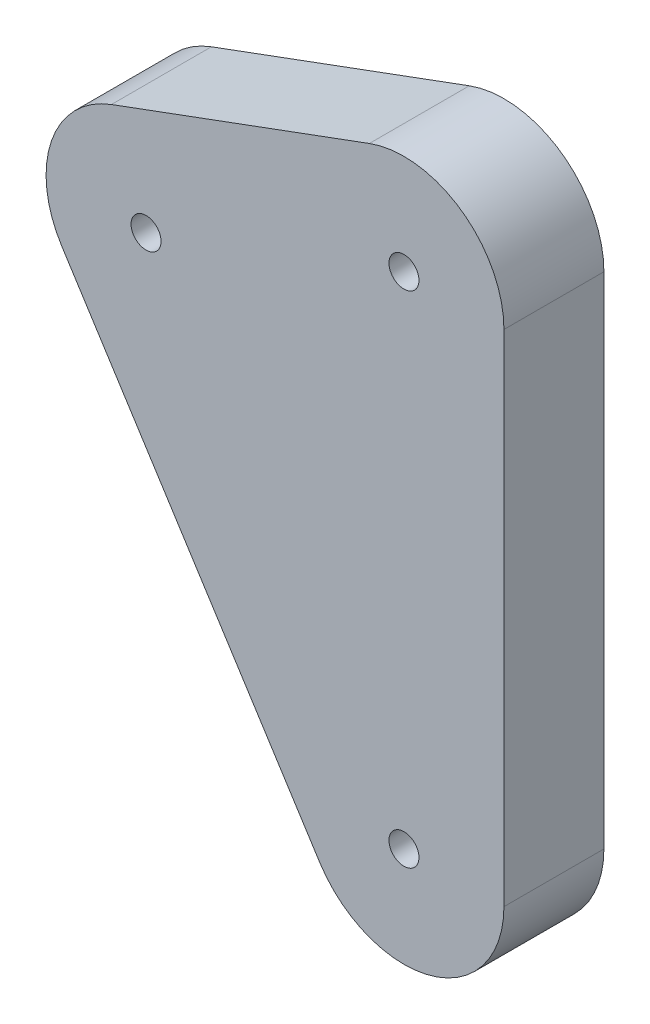
ISO-10303-21;
HEADER;
FILE_DESCRIPTION(('STEP AP214'),'2;1');
FILE_NAME('part.step','',(''),(''),'','','');
FILE_SCHEMA(('AUTOMOTIVE_DESIGN { 1 0 10303 214 1 1 1 1 }'));
ENDSEC;
DATA;
#1=APPLICATION_CONTEXT('core data for automotive mechanical design processes');
#2=APPLICATION_PROTOCOL_DEFINITION('international standard','automotive_design',2000,#1);
#3=PRODUCT_CONTEXT('',#1,'mechanical');
#4=PRODUCT('Part','Part','',(#3));
#5=PRODUCT_RELATED_PRODUCT_CATEGORY('part','',(#4));
#6=PRODUCT_DEFINITION_FORMATION('','',#4);
#7=PRODUCT_DEFINITION_CONTEXT('part definition',#1,'design');
#8=PRODUCT_DEFINITION('design','',#6,#7);
#9=PRODUCT_DEFINITION_SHAPE('','',#8);
#10=(LENGTH_UNIT() NAMED_UNIT(*) SI_UNIT(.MILLI.,.METRE.));
#11=(NAMED_UNIT(*) PLANE_ANGLE_UNIT() SI_UNIT($,.RADIAN.));
#12=(NAMED_UNIT(*) SI_UNIT($,.STERADIAN.) SOLID_ANGLE_UNIT());
#13=UNCERTAINTY_MEASURE_WITH_UNIT(LENGTH_MEASURE(1.E-05),#10,'distance_accuracy_value','');
#14=(GEOMETRIC_REPRESENTATION_CONTEXT(3) GLOBAL_UNCERTAINTY_ASSIGNED_CONTEXT((#13)) GLOBAL_UNIT_ASSIGNED_CONTEXT((#10,
#11,#12)) REPRESENTATION_CONTEXT('',''));
#15=CARTESIAN_POINT('',(0.,0.,0.));
#16=DIRECTION('',(0.,0.,1.));
#17=DIRECTION('',(1.,0.,0.));
#18=AXIS2_PLACEMENT_3D('',#15,#16,#17);
#19=CARTESIAN_POINT('',(0.,50.,10.));
#20=DIRECTION('',(0.,0.,1.));
#21=DIRECTION('',(1.,0.,0.));
#22=AXIS2_PLACEMENT_3D('',#19,#20,#21);
#23=PLANE('',#22);
#24=CARTESIAN_POINT('',(0.,50.,10.));
#25=DIRECTION('',(0.,0.,1.));
#26=DIRECTION('',(1.,0.,0.));
#27=AXIS2_PLACEMENT_3D('',#24,#25,#26);
#28=CIRCLE('',#27,1.5);
#29=CARTESIAN_POINT('',(1.5,50.,10.));
#30=VERTEX_POINT('',#29);
#31=EDGE_CURVE('E207',#30,#30,#28,.T.);
#32=ORIENTED_EDGE('',*,*,#31,.F.);
#33=EDGE_LOOP('',(#32));
#34=FACE_BOUND('',#33,.T.);
#35=CARTESIAN_POINT('',(0.,50.,10.));
#36=DIRECTION('',(0.,0.,1.));
#37=DIRECTION('',(1.,0.,0.));
#38=AXIS2_PLACEMENT_3D('',#35,#36,#37);
#39=CIRCLE('',#38,10.);
#40=CARTESIAN_POINT('',(10.,50.,10.));
#41=VERTEX_POINT('',#40);
#42=CARTESIAN_POINT('',(-3.46272727272727,59.3813389148197,10.));
#43=VERTEX_POINT('',#42);
#44=EDGE_CURVE('E146',#41,#43,#39,.T.);
#45=ORIENTED_EDGE('',*,*,#44,.T.);
#46=DIRECTION('',(-0.938133891481972,-0.346272727272727,0.));
#47=VECTOR('',#46,1.);
#48=CARTESIAN_POINT('',(-29.2614092884815,49.8588389148197,10.));
#49=LINE('',#48,#47);
#50=CARTESIAN_POINT('',(-29.2614092884815,49.8588389148197,10.));
#51=VERTEX_POINT('',#50);
#52=EDGE_CURVE('E94',#43,#51,#49,.T.);
#53=ORIENTED_EDGE('',*,*,#52,.T.);
#54=CARTESIAN_POINT('',(-25.7986820157542,40.4775,10.));
#55=DIRECTION('',(0.,0.,1.));
#56=DIRECTION('',(1.,0.,0.));
#57=AXIS2_PLACEMENT_3D('',#54,#55,#56);
#58=CIRCLE('',#57,10.);
#59=CARTESIAN_POINT('',(-34.2314945157542,35.1027745800512,10.));
#60=VERTEX_POINT('',#59);
#61=EDGE_CURVE('E107',#51,#60,#58,.T.);
#62=ORIENTED_EDGE('',*,*,#61,.T.);
#63=DIRECTION('',(0.537472541994879,-0.84328125,0.));
#64=VECTOR('',#63,1.);
#65=CARTESIAN_POINT('',(-8.4328125,-5.3747254199488,10.));
#66=LINE('',#65,#64);
#67=CARTESIAN_POINT('',(-8.4328125,-5.3747254199488,10.));
#68=VERTEX_POINT('',#67);
#69=EDGE_CURVE('E101',#60,#68,#66,.T.);
#70=ORIENTED_EDGE('',*,*,#69,.T.);
#71=CARTESIAN_POINT('',(0.,0.,10.));
#72=DIRECTION('',(0.,0.,1.));
#73=DIRECTION('',(1.,0.,0.));
#74=AXIS2_PLACEMENT_3D('',#71,#72,#73);
#75=CIRCLE('',#74,10.);
#76=CARTESIAN_POINT('',(10.,0.,10.));
#77=VERTEX_POINT('',#76);
#78=EDGE_CURVE('E105',#68,#77,#75,.T.);
#79=ORIENTED_EDGE('',*,*,#78,.T.);
#80=DIRECTION('',(0.,1.,0.));
#81=VECTOR('',#80,1.);
#82=CARTESIAN_POINT('',(10.,50.,10.));
#83=LINE('',#82,#81);
#84=EDGE_CURVE('E57',#77,#41,#83,.T.);
#85=ORIENTED_EDGE('',*,*,#84,.T.);
#86=EDGE_LOOP('',(#45,#53,#62,#70,#79,#85));
#87=FACE_BOUND('',#86,.T.);
#88=CARTESIAN_POINT('',(-25.7986820157542,40.4775,10.));
#89=DIRECTION('',(0.,0.,1.));
#90=DIRECTION('',(1.,0.,0.));
#91=AXIS2_PLACEMENT_3D('',#88,#89,#90);
#92=CIRCLE('',#91,1.5);
#93=CARTESIAN_POINT('',(-24.2986820157542,40.4775,10.));
#94=VERTEX_POINT('',#93);
#95=EDGE_CURVE('E134',#94,#94,#92,.T.);
#96=ORIENTED_EDGE('',*,*,#95,.F.);
#97=EDGE_LOOP('',(#96));
#98=FACE_BOUND('',#97,.T.);
#99=CARTESIAN_POINT('',(0.,0.,10.));
#100=DIRECTION('',(0.,0.,1.));
#101=DIRECTION('',(1.,0.,0.));
#102=AXIS2_PLACEMENT_3D('',#99,#100,#101);
#103=CIRCLE('',#102,1.5);
#104=CARTESIAN_POINT('',(1.5,0.,10.));
#105=VERTEX_POINT('',#104);
#106=EDGE_CURVE('E196',#105,#105,#103,.T.);
#107=ORIENTED_EDGE('',*,*,#106,.F.);
#108=EDGE_LOOP('',(#107));
#109=FACE_BOUND('',#108,.T.);
#110=ADVANCED_FACE('F39',(#34,#87,#98,#109),#23,.T.);
#111=CARTESIAN_POINT('',(0.,50.,0.));
#112=DIRECTION('',(0.,0.,1.));
#113=DIRECTION('',(1.,0.,0.));
#114=AXIS2_PLACEMENT_3D('',#111,#112,#113);
#115=PLANE('',#114);
#116=CARTESIAN_POINT('',(0.,50.,0.));
#117=DIRECTION('',(0.,0.,1.));
#118=DIRECTION('',(1.,0.,0.));
#119=AXIS2_PLACEMENT_3D('',#116,#117,#118);
#120=CIRCLE('',#119,10.);
#121=CARTESIAN_POINT('',(10.,50.,0.));
#122=VERTEX_POINT('',#121);
#123=CARTESIAN_POINT('',(-3.46272727272727,59.3813389148197,0.));
#124=VERTEX_POINT('',#123);
#125=EDGE_CURVE('E129',#122,#124,#120,.T.);
#126=ORIENTED_EDGE('',*,*,#125,.F.);
#127=DIRECTION('',(0.,1.,0.));
#128=VECTOR('',#127,1.);
#129=CARTESIAN_POINT('',(10.,50.,0.));
#130=LINE('',#129,#128);
#131=CARTESIAN_POINT('',(10.,0.,0.));
#132=VERTEX_POINT('',#131);
#133=EDGE_CURVE('E86',#132,#122,#130,.T.);
#134=ORIENTED_EDGE('',*,*,#133,.F.);
#135=CARTESIAN_POINT('',(0.,0.,0.));
#136=DIRECTION('',(0.,0.,1.));
#137=DIRECTION('',(1.,0.,0.));
#138=AXIS2_PLACEMENT_3D('',#135,#136,#137);
#139=CIRCLE('',#138,10.);
#140=CARTESIAN_POINT('',(-8.4328125,-5.3747254199488,0.));
#141=VERTEX_POINT('',#140);
#142=EDGE_CURVE('E80',#141,#132,#139,.T.);
#143=ORIENTED_EDGE('',*,*,#142,.F.);
#144=DIRECTION('',(0.537472541994879,-0.84328125,0.));
#145=VECTOR('',#144,1.);
#146=CARTESIAN_POINT('',(-8.4328125,-5.3747254199488,0.));
#147=LINE('',#146,#145);
#148=CARTESIAN_POINT('',(-34.2314945157542,35.1027745800512,0.));
#149=VERTEX_POINT('',#148);
#150=EDGE_CURVE('E116',#149,#141,#147,.T.);
#151=ORIENTED_EDGE('',*,*,#150,.F.);
#152=CARTESIAN_POINT('',(-25.7986820157542,40.4775,0.));
#153=DIRECTION('',(0.,0.,1.));
#154=DIRECTION('',(1.,0.,0.));
#155=AXIS2_PLACEMENT_3D('',#152,#153,#154);
#156=CIRCLE('',#155,10.);
#157=CARTESIAN_POINT('',(-29.2614092884815,49.8588389148197,0.));
#158=VERTEX_POINT('',#157);
#159=EDGE_CURVE('E137',#158,#149,#156,.T.);
#160=ORIENTED_EDGE('',*,*,#159,.F.);
#161=DIRECTION('',(-0.938133891481972,-0.346272727272727,0.));
#162=VECTOR('',#161,1.);
#163=CARTESIAN_POINT('',(-29.2614092884815,49.8588389148197,0.));
#164=LINE('',#163,#162);
#165=EDGE_CURVE('E133',#124,#158,#164,.T.);
#166=ORIENTED_EDGE('',*,*,#165,.F.);
#167=EDGE_LOOP('',(#126,#134,#143,#151,#160,#166));
#168=FACE_BOUND('',#167,.T.);
#169=CARTESIAN_POINT('',(-25.7986820157542,40.4775,0.));
#170=DIRECTION('',(0.,0.,1.));
#171=DIRECTION('',(1.,0.,0.));
#172=AXIS2_PLACEMENT_3D('',#169,#170,#171);
#173=CIRCLE('',#172,1.5);
#174=CARTESIAN_POINT('',(-24.2986820157542,40.4775,0.));
#175=VERTEX_POINT('',#174);
#176=EDGE_CURVE('E211',#175,#175,#173,.T.);
#177=ORIENTED_EDGE('',*,*,#176,.T.);
#178=EDGE_LOOP('',(#177));
#179=FACE_BOUND('',#178,.T.);
#180=CARTESIAN_POINT('',(0.,50.,0.));
#181=DIRECTION('',(0.,0.,1.));
#182=DIRECTION('',(1.,0.,0.));
#183=AXIS2_PLACEMENT_3D('',#180,#181,#182);
#184=CIRCLE('',#183,1.5);
#185=CARTESIAN_POINT('',(1.5,50.,0.));
#186=VERTEX_POINT('',#185);
#187=EDGE_CURVE('E204',#186,#186,#184,.T.);
#188=ORIENTED_EDGE('',*,*,#187,.T.);
#189=EDGE_LOOP('',(#188));
#190=FACE_BOUND('',#189,.T.);
#191=CARTESIAN_POINT('',(0.,0.,0.));
#192=DIRECTION('',(0.,0.,1.));
#193=DIRECTION('',(1.,0.,0.));
#194=AXIS2_PLACEMENT_3D('',#191,#192,#193);
#195=CIRCLE('',#194,1.5);
#196=CARTESIAN_POINT('',(1.5,0.,0.));
#197=VERTEX_POINT('',#196);
#198=EDGE_CURVE('E199',#197,#197,#195,.T.);
#199=ORIENTED_EDGE('',*,*,#198,.T.);
#200=EDGE_LOOP('',(#199));
#201=FACE_BOUND('',#200,.T.);
#202=ADVANCED_FACE('F159',(#168,#179,#190,#201),#115,.F.);
#203=CARTESIAN_POINT('',(0.,50.,10.));
#204=DIRECTION('',(0.,0.,-1.));
#205=DIRECTION('',(-1.,0.,0.));
#206=AXIS2_PLACEMENT_3D('',#203,#204,#205);
#207=CYLINDRICAL_SURFACE('',#206,10.);
#208=ORIENTED_EDGE('',*,*,#125,.T.);
#209=DIRECTION('',(0.,0.,-1.));
#210=VECTOR('',#209,1.);
#211=CARTESIAN_POINT('',(-3.46272727272727,59.3813389148197,10.));
#212=LINE('',#211,#210);
#213=EDGE_CURVE('E11',#43,#124,#212,.T.);
#214=ORIENTED_EDGE('',*,*,#213,.F.);
#215=ORIENTED_EDGE('',*,*,#44,.F.);
#216=DIRECTION('',(0.,0.,-1.));
#217=VECTOR('',#216,1.);
#218=CARTESIAN_POINT('',(10.,50.,10.));
#219=LINE('',#218,#217);
#220=EDGE_CURVE('E125',#41,#122,#219,.T.);
#221=ORIENTED_EDGE('',*,*,#220,.T.);
#222=EDGE_LOOP('',(#208,#214,#215,#221));
#223=FACE_BOUND('',#222,.T.);
#224=ADVANCED_FACE('F41',(#223),#207,.T.);
#225=CARTESIAN_POINT('',(-29.2614092884815,49.8588389148197,10.));
#226=DIRECTION('',(0.346272727272727,-0.938133891481972,0.));
#227=DIRECTION('',(0.938133891481972,0.346272727272727,0.));
#228=AXIS2_PLACEMENT_3D('',#225,#226,#227);
#229=PLANE('',#228);
#230=ORIENTED_EDGE('',*,*,#165,.T.);
#231=DIRECTION('',(0.,0.,-1.));
#232=VECTOR('',#231,1.);
#233=CARTESIAN_POINT('',(-29.2614092884815,49.8588389148197,10.));
#234=LINE('',#233,#232);
#235=EDGE_CURVE('E49',#51,#158,#234,.T.);
#236=ORIENTED_EDGE('',*,*,#235,.F.);
#237=ORIENTED_EDGE('',*,*,#52,.F.);
#238=ORIENTED_EDGE('',*,*,#213,.T.);
#239=EDGE_LOOP('',(#230,#236,#237,#238));
#240=FACE_BOUND('',#239,.T.);
#241=ADVANCED_FACE('F267',(#240),#229,.F.);
#242=CARTESIAN_POINT('',(-25.7986820157542,40.4775,10.));
#243=DIRECTION('',(0.,0.,-1.));
#244=DIRECTION('',(-1.,0.,0.));
#245=AXIS2_PLACEMENT_3D('',#242,#243,#244);
#246=CYLINDRICAL_SURFACE('',#245,10.);
#247=ORIENTED_EDGE('',*,*,#159,.T.);
#248=DIRECTION('',(0.,0.,-1.));
#249=VECTOR('',#248,1.);
#250=CARTESIAN_POINT('',(-34.2314945157542,35.1027745800512,10.));
#251=LINE('',#250,#249);
#252=EDGE_CURVE('E118',#60,#149,#251,.T.);
#253=ORIENTED_EDGE('',*,*,#252,.F.);
#254=ORIENTED_EDGE('',*,*,#61,.F.);
#255=ORIENTED_EDGE('',*,*,#235,.T.);
#256=EDGE_LOOP('',(#247,#253,#254,#255));
#257=FACE_BOUND('',#256,.T.);
#258=ADVANCED_FACE('F156',(#257),#246,.T.);
#259=CARTESIAN_POINT('',(-8.4328125,-5.3747254199488,10.));
#260=DIRECTION('',(0.84328125,0.537472541994879,0.));
#261=DIRECTION('',(-0.537472541994879,0.84328125,0.));
#262=AXIS2_PLACEMENT_3D('',#259,#260,#261);
#263=PLANE('',#262);
#264=ORIENTED_EDGE('',*,*,#150,.T.);
#265=DIRECTION('',(0.,0.,-1.));
#266=VECTOR('',#265,1.);
#267=CARTESIAN_POINT('',(-8.4328125,-5.3747254199488,10.));
#268=LINE('',#267,#266);
#269=EDGE_CURVE('E113',#68,#141,#268,.T.);
#270=ORIENTED_EDGE('',*,*,#269,.F.);
#271=ORIENTED_EDGE('',*,*,#69,.F.);
#272=ORIENTED_EDGE('',*,*,#252,.T.);
#273=EDGE_LOOP('',(#264,#270,#271,#272));
#274=FACE_BOUND('',#273,.T.);
#275=ADVANCED_FACE('F114',(#274),#263,.F.);
#276=CARTESIAN_POINT('',(0.,0.,10.));
#277=DIRECTION('',(0.,0.,-1.));
#278=DIRECTION('',(-1.,0.,0.));
#279=AXIS2_PLACEMENT_3D('',#276,#277,#278);
#280=CYLINDRICAL_SURFACE('',#279,10.);
#281=ORIENTED_EDGE('',*,*,#142,.T.);
#282=DIRECTION('',(0.,0.,-1.));
#283=VECTOR('',#282,1.);
#284=CARTESIAN_POINT('',(10.,0.,10.));
#285=LINE('',#284,#283);
#286=EDGE_CURVE('E119',#77,#132,#285,.T.);
#287=ORIENTED_EDGE('',*,*,#286,.F.);
#288=ORIENTED_EDGE('',*,*,#78,.F.);
#289=ORIENTED_EDGE('',*,*,#269,.T.);
#290=EDGE_LOOP('',(#281,#287,#288,#289));
#291=FACE_BOUND('',#290,.T.);
#292=ADVANCED_FACE('F121',(#291),#280,.T.);
#293=CARTESIAN_POINT('',(10.,50.,10.));
#294=DIRECTION('',(-1.,0.,0.));
#295=DIRECTION('',(0.,-1.,0.));
#296=AXIS2_PLACEMENT_3D('',#293,#294,#295);
#297=PLANE('',#296);
#298=ORIENTED_EDGE('',*,*,#133,.T.);
#299=ORIENTED_EDGE('',*,*,#220,.F.);
#300=ORIENTED_EDGE('',*,*,#84,.F.);
#301=ORIENTED_EDGE('',*,*,#286,.T.);
#302=EDGE_LOOP('',(#298,#299,#300,#301));
#303=FACE_BOUND('',#302,.T.);
#304=ADVANCED_FACE('F164',(#303),#297,.F.);
#305=CARTESIAN_POINT('',(-25.7986820157542,40.4775,10.));
#306=DIRECTION('',(0.,0.,-1.));
#307=DIRECTION('',(-1.,0.,0.));
#308=AXIS2_PLACEMENT_3D('',#305,#306,#307);
#309=CYLINDRICAL_SURFACE('',#308,1.5);
#310=ORIENTED_EDGE('',*,*,#95,.T.);
#311=EDGE_LOOP('',(#310));
#312=FACE_BOUND('',#311,.T.);
#313=ORIENTED_EDGE('',*,*,#176,.F.);
#314=EDGE_LOOP('',(#313));
#315=FACE_BOUND('',#314,.T.);
#316=ADVANCED_FACE('F166',(#312,#315),#309,.F.);
#317=CARTESIAN_POINT('',(0.,50.,10.));
#318=DIRECTION('',(0.,0.,-1.));
#319=DIRECTION('',(-1.,0.,0.));
#320=AXIS2_PLACEMENT_3D('',#317,#318,#319);
#321=CYLINDRICAL_SURFACE('',#320,1.5);
#322=ORIENTED_EDGE('',*,*,#31,.T.);
#323=EDGE_LOOP('',(#322));
#324=FACE_BOUND('',#323,.T.);
#325=ORIENTED_EDGE('',*,*,#187,.F.);
#326=EDGE_LOOP('',(#325));
#327=FACE_BOUND('',#326,.T.);
#328=ADVANCED_FACE('F172',(#324,#327),#321,.F.);
#329=CARTESIAN_POINT('',(0.,0.,10.));
#330=DIRECTION('',(0.,0.,-1.));
#331=DIRECTION('',(-1.,0.,0.));
#332=AXIS2_PLACEMENT_3D('',#329,#330,#331);
#333=CYLINDRICAL_SURFACE('',#332,1.5);
#334=ORIENTED_EDGE('',*,*,#106,.T.);
#335=EDGE_LOOP('',(#334));
#336=FACE_BOUND('',#335,.T.);
#337=ORIENTED_EDGE('',*,*,#198,.F.);
#338=EDGE_LOOP('',(#337));
#339=FACE_BOUND('',#338,.T.);
#340=ADVANCED_FACE('F187',(#336,#339),#333,.F.);
#341=CLOSED_SHELL('',(#110,#202,#224,#241,#258,#275,#292,#304,#316,#328,#340));
#342=MANIFOLD_SOLID_BREP('B2',#341);
#343=ADVANCED_BREP_SHAPE_REPRESENTATION('',(#18,#342),#14);
#344=SHAPE_DEFINITION_REPRESENTATION(#9,#343);
ENDSEC;
END-ISO-10303-21;
